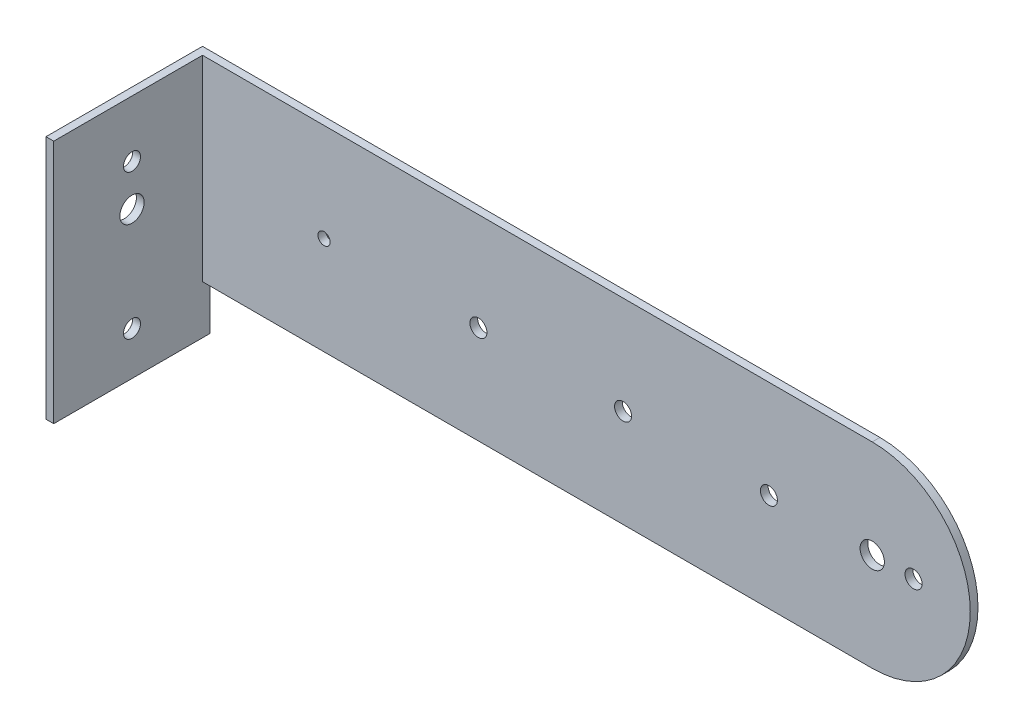
ISO-10303-21;
HEADER;
FILE_DESCRIPTION(('STEP AP214'),'2;1');
FILE_NAME('part.step','',(''),(''),'','','');
FILE_SCHEMA(('AUTOMOTIVE_DESIGN { 1 0 10303 214 1 1 1 1 }'));
ENDSEC;
DATA;
#1=APPLICATION_CONTEXT('core data for automotive mechanical design processes');
#2=APPLICATION_PROTOCOL_DEFINITION('international standard','automotive_design',2000,#1);
#3=PRODUCT_CONTEXT('',#1,'mechanical');
#4=PRODUCT('Part','Part','',(#3));
#5=PRODUCT_RELATED_PRODUCT_CATEGORY('part','',(#4));
#6=PRODUCT_DEFINITION_FORMATION('','',#4);
#7=PRODUCT_DEFINITION_CONTEXT('part definition',#1,'design');
#8=PRODUCT_DEFINITION('design','',#6,#7);
#9=PRODUCT_DEFINITION_SHAPE('','',#8);
#10=(LENGTH_UNIT() NAMED_UNIT(*) SI_UNIT(.MILLI.,.METRE.));
#11=(NAMED_UNIT(*) PLANE_ANGLE_UNIT() SI_UNIT($,.RADIAN.));
#12=(NAMED_UNIT(*) SI_UNIT($,.STERADIAN.) SOLID_ANGLE_UNIT());
#13=UNCERTAINTY_MEASURE_WITH_UNIT(LENGTH_MEASURE(1.E-05),#10,'distance_accuracy_value','');
#14=(GEOMETRIC_REPRESENTATION_CONTEXT(3) GLOBAL_UNCERTAINTY_ASSIGNED_CONTEXT((#13)) GLOBAL_UNIT_ASSIGNED_CONTEXT((#10,
#11,#12)) REPRESENTATION_CONTEXT('',''));
#15=CARTESIAN_POINT('',(0.,0.,0.));
#16=DIRECTION('',(0.,0.,1.));
#17=DIRECTION('',(1.,0.,0.));
#18=AXIS2_PLACEMENT_3D('',#15,#16,#17);
#19=CARTESIAN_POINT('',(-39.6100352366991,-20.1682003035615,1.59));
#20=DIRECTION('',(0.,1.,0.));
#21=DIRECTION('',(0.,0.,1.));
#22=AXIS2_PLACEMENT_3D('',#19,#20,#21);
#23=PLANE('',#22);
#24=DIRECTION('',(0.,0.,1.));
#25=VECTOR('',#24,1.);
#26=CARTESIAN_POINT('',(-98.1399647633009,-20.1682003035615,0.));
#27=LINE('',#26,#25);
#28=CARTESIAN_POINT('',(-98.1399647633009,-20.1682003035615,0.));
#29=VERTEX_POINT('',#28);
#30=CARTESIAN_POINT('',(-98.1399647633009,-20.1682003035615,1.59));
#31=VERTEX_POINT('',#30);
#32=EDGE_CURVE('E50',#29,#31,#27,.T.);
#33=ORIENTED_EDGE('',*,*,#32,.F.);
#34=DIRECTION('',(1.,0.,0.));
#35=VECTOR('',#34,1.);
#36=CARTESIAN_POINT('',(-39.6100352366991,-20.1682003035615,0.));
#37=LINE('',#36,#35);
#38=CARTESIAN_POINT('',(39.6100352366991,-20.1682003035615,0.));
#39=VERTEX_POINT('',#38);
#40=EDGE_CURVE('E103',#29,#39,#37,.T.);
#41=ORIENTED_EDGE('',*,*,#40,.T.);
#42=DIRECTION('',(0.,0.,-1.));
#43=VECTOR('',#42,1.);
#44=CARTESIAN_POINT('',(39.6100352366991,-20.1682003035615,1.59));
#45=LINE('',#44,#43);
#46=CARTESIAN_POINT('',(39.6100352366991,-20.1682003035615,1.59));
#47=VERTEX_POINT('',#46);
#48=EDGE_CURVE('E42',#47,#39,#45,.T.);
#49=ORIENTED_EDGE('',*,*,#48,.F.);
#50=DIRECTION('',(1.,0.,0.));
#51=VECTOR('',#50,1.);
#52=CARTESIAN_POINT('',(-99.7299647633009,-20.1682003035615,1.59));
#53=LINE('',#52,#51);
#54=EDGE_CURVE('E180',#31,#47,#53,.T.);
#55=ORIENTED_EDGE('',*,*,#54,.F.);
#56=EDGE_LOOP('',(#33,#41,#49,#55));
#57=FACE_BOUND('',#56,.T.);
#58=ADVANCED_FACE('F33',(#57),#23,.F.);
#59=CARTESIAN_POINT('',(-99.7299647633009,20.1682003035615,1.59));
#60=DIRECTION('',(1.,0.,0.));
#61=DIRECTION('',(0.,0.,-1.));
#62=AXIS2_PLACEMENT_3D('',#59,#60,#61);
#63=PLANE('',#62);
#64=DIRECTION('',(0.,-1.,0.));
#65=VECTOR('',#64,1.);
#66=CARTESIAN_POINT('',(-99.7299647633009,20.1682003035615,0.));
#67=LINE('',#66,#65);
#68=CARTESIAN_POINT('',(-99.7299647633009,20.1682003035615,0.));
#69=VERTEX_POINT('',#68);
#70=CARTESIAN_POINT('',(-99.7299647633009,-30.1682003035615,0.));
#71=VERTEX_POINT('',#70);
#72=EDGE_CURVE('E95',#69,#71,#67,.T.);
#73=ORIENTED_EDGE('',*,*,#72,.T.);
#74=DIRECTION('',(0.,0.,1.));
#75=VECTOR('',#74,1.);
#76=CARTESIAN_POINT('',(-99.7299647633009,-30.1682003035615,0.));
#77=LINE('',#76,#75);
#78=CARTESIAN_POINT('',(-99.7299647633009,-30.1682003035615,32.192));
#79=VERTEX_POINT('',#78);
#80=EDGE_CURVE('E100',#71,#79,#77,.T.);
#81=ORIENTED_EDGE('',*,*,#80,.T.);
#82=DIRECTION('',(0.,-1.,0.));
#83=VECTOR('',#82,1.);
#84=CARTESIAN_POINT('',(-99.7299647633009,20.1682003035615,32.192));
#85=LINE('',#84,#83);
#86=CARTESIAN_POINT('',(-99.7299647633009,20.1682003035615,32.192));
#87=VERTEX_POINT('',#86);
#88=EDGE_CURVE('E145',#87,#79,#85,.T.);
#89=ORIENTED_EDGE('',*,*,#88,.F.);
#90=DIRECTION('',(0.,0.,-1.));
#91=VECTOR('',#90,1.);
#92=CARTESIAN_POINT('',(-99.7299647633009,20.1682003035615,1.59));
#93=LINE('',#92,#91);
#94=EDGE_CURVE('E101',#87,#69,#93,.T.);
#95=ORIENTED_EDGE('',*,*,#94,.T.);
#96=EDGE_LOOP('',(#73,#81,#89,#95));
#97=FACE_BOUND('',#96,.T.);
#98=CARTESIAN_POINT('',(-99.7299647633009,8.5,16.096));
#99=DIRECTION('',(-1.,0.,0.));
#100=DIRECTION('',(0.,0.,1.));
#101=AXIS2_PLACEMENT_3D('',#98,#99,#100);
#102=CIRCLE('',#101,1.75);
#103=CARTESIAN_POINT('',(-99.7299647633009,8.5,17.846));
#104=VERTEX_POINT('',#103);
#105=EDGE_CURVE('E129',#104,#104,#102,.T.);
#106=ORIENTED_EDGE('',*,*,#105,.F.);
#107=EDGE_LOOP('',(#106));
#108=FACE_BOUND('',#107,.T.);
#109=CARTESIAN_POINT('',(-99.7299647633009,0.,16.096));
#110=DIRECTION('',(-1.,0.,0.));
#111=DIRECTION('',(0.,0.,1.));
#112=AXIS2_PLACEMENT_3D('',#109,#110,#111);
#113=CIRCLE('',#112,2.5);
#114=CARTESIAN_POINT('',(-99.7299647633009,0.,18.596));
#115=VERTEX_POINT('',#114);
#116=EDGE_CURVE('E135',#115,#115,#113,.T.);
#117=ORIENTED_EDGE('',*,*,#116,.F.);
#118=EDGE_LOOP('',(#117));
#119=FACE_BOUND('',#118,.T.);
#120=CARTESIAN_POINT('',(-99.7299647633009,-21.25,16.096));
#121=DIRECTION('',(-1.,0.,0.));
#122=DIRECTION('',(0.,0.,1.));
#123=AXIS2_PLACEMENT_3D('',#120,#121,#122);
#124=CIRCLE('',#123,1.75);
#125=CARTESIAN_POINT('',(-99.7299647633009,-21.25,17.846));
#126=VERTEX_POINT('',#125);
#127=EDGE_CURVE('E128',#126,#126,#124,.T.);
#128=ORIENTED_EDGE('',*,*,#127,.F.);
#129=EDGE_LOOP('',(#128));
#130=FACE_BOUND('',#129,.T.);
#131=ADVANCED_FACE('F35',(#97,#108,#119,#130),#63,.F.);
#132=CARTESIAN_POINT('',(39.6100352366991,0.,1.59));
#133=DIRECTION('',(0.,0.,-1.));
#134=DIRECTION('',(-1.,0.,0.));
#135=AXIS2_PLACEMENT_3D('',#132,#133,#134);
#136=CYLINDRICAL_SURFACE('',#135,20.1682003035615);
#137=CARTESIAN_POINT('',(39.6100352366991,0.,0.));
#138=DIRECTION('',(0.,0.,1.));
#139=DIRECTION('',(1.,0.,0.));
#140=AXIS2_PLACEMENT_3D('',#137,#138,#139);
#141=CIRCLE('',#140,20.1682003035615);
#142=CARTESIAN_POINT('',(39.6100352366991,20.1682003035615,0.));
#143=VERTEX_POINT('',#142);
#144=EDGE_CURVE('E188',#39,#143,#141,.T.);
#145=ORIENTED_EDGE('',*,*,#144,.T.);
#146=DIRECTION('',(0.,0.,-1.));
#147=VECTOR('',#146,1.);
#148=CARTESIAN_POINT('',(39.6100352366991,20.1682003035615,1.59));
#149=LINE('',#148,#147);
#150=CARTESIAN_POINT('',(39.6100352366991,20.1682003035615,1.59));
#151=VERTEX_POINT('',#150);
#152=EDGE_CURVE('E193',#151,#143,#149,.T.);
#153=ORIENTED_EDGE('',*,*,#152,.F.);
#154=CARTESIAN_POINT('',(39.6100352366991,0.,1.59));
#155=DIRECTION('',(0.,0.,1.));
#156=DIRECTION('',(1.,0.,0.));
#157=AXIS2_PLACEMENT_3D('',#154,#155,#156);
#158=CIRCLE('',#157,20.1682003035615);
#159=EDGE_CURVE('E182',#47,#151,#158,.T.);
#160=ORIENTED_EDGE('',*,*,#159,.F.);
#161=ORIENTED_EDGE('',*,*,#48,.T.);
#162=EDGE_LOOP('',(#145,#153,#160,#161));
#163=FACE_BOUND('',#162,.T.);
#164=ADVANCED_FACE('F223',(#163),#136,.T.);
#165=CARTESIAN_POINT('',(-39.6100352366991,20.1682003035615,1.59));
#166=DIRECTION('',(0.,-1.,0.));
#167=DIRECTION('',(0.,0.,-1.));
#168=AXIS2_PLACEMENT_3D('',#165,#166,#167);
#169=PLANE('',#168);
#170=DIRECTION('',(-1.,0.,0.));
#171=VECTOR('',#170,1.);
#172=CARTESIAN_POINT('',(-39.6100352366991,20.1682003035615,0.));
#173=LINE('',#172,#171);
#174=EDGE_CURVE('E183',#143,#69,#173,.T.);
#175=ORIENTED_EDGE('',*,*,#174,.T.);
#176=ORIENTED_EDGE('',*,*,#94,.F.);
#177=DIRECTION('',(-1.,0.,0.));
#178=VECTOR('',#177,1.);
#179=CARTESIAN_POINT('',(-98.1399647633009,20.1682003035615,32.192));
#180=LINE('',#179,#178);
#181=CARTESIAN_POINT('',(-98.1399647633009,20.1682003035615,32.192));
#182=VERTEX_POINT('',#181);
#183=EDGE_CURVE('E142',#182,#87,#180,.T.);
#184=ORIENTED_EDGE('',*,*,#183,.F.);
#185=DIRECTION('',(0.,0.,-1.));
#186=VECTOR('',#185,1.);
#187=CARTESIAN_POINT('',(-98.1399647633009,20.1682003035615,32.192));
#188=LINE('',#187,#186);
#189=CARTESIAN_POINT('',(-98.1399647633009,20.1682003035615,1.59));
#190=VERTEX_POINT('',#189);
#191=EDGE_CURVE('E147',#182,#190,#188,.T.);
#192=ORIENTED_EDGE('',*,*,#191,.T.);
#193=DIRECTION('',(-1.,0.,0.));
#194=VECTOR('',#193,1.);
#195=CARTESIAN_POINT('',(-39.6100352366991,20.1682003035615,1.59));
#196=LINE('',#195,#194);
#197=EDGE_CURVE('E185',#151,#190,#196,.T.);
#198=ORIENTED_EDGE('',*,*,#197,.F.);
#199=ORIENTED_EDGE('',*,*,#152,.T.);
#200=EDGE_LOOP('',(#175,#176,#184,#192,#198,#199));
#201=FACE_BOUND('',#200,.T.);
#202=ADVANCED_FACE('F227',(#201),#169,.F.);
#203=CARTESIAN_POINT('',(39.6100352366991,0.,1.59));
#204=DIRECTION('',(0.,0.,1.));
#205=DIRECTION('',(1.,0.,0.));
#206=AXIS2_PLACEMENT_3D('',#203,#204,#205);
#207=PLANE('',#206);
#208=CARTESIAN_POINT('',(-73.1399647633009,0.,1.59));
#209=DIRECTION('',(0.,0.,1.));
#210=DIRECTION('',(1.,0.,0.));
#211=AXIS2_PLACEMENT_3D('',#208,#209,#210);
#212=CIRCLE('',#211,1.25);
#213=CARTESIAN_POINT('',(-71.8899647633009,0.,1.59));
#214=VERTEX_POINT('',#213);
#215=EDGE_CURVE('E121',#214,#214,#212,.T.);
#216=ORIENTED_EDGE('',*,*,#215,.F.);
#217=EDGE_LOOP('',(#216));
#218=FACE_BOUND('',#217,.T.);
#219=DIRECTION('',(0.,1.,0.));
#220=VECTOR('',#219,1.);
#221=CARTESIAN_POINT('',(-98.1399647633009,20.1682003035615,1.59));
#222=LINE('',#221,#220);
#223=EDGE_CURVE('E58',#31,#190,#222,.T.);
#224=ORIENTED_EDGE('',*,*,#223,.F.);
#225=ORIENTED_EDGE('',*,*,#54,.T.);
#226=ORIENTED_EDGE('',*,*,#159,.T.);
#227=ORIENTED_EDGE('',*,*,#197,.T.);
#228=EDGE_LOOP('',(#224,#225,#226,#227));
#229=FACE_BOUND('',#228,.T.);
#230=CARTESIAN_POINT('',(48.1100352366991,0.,1.59));
#231=DIRECTION('',(0.,0.,1.));
#232=DIRECTION('',(1.,0.,0.));
#233=AXIS2_PLACEMENT_3D('',#230,#231,#232);
#234=CIRCLE('',#233,1.75);
#235=CARTESIAN_POINT('',(49.8600352366991,0.,1.59));
#236=VERTEX_POINT('',#235);
#237=EDGE_CURVE('E156',#236,#236,#234,.T.);
#238=ORIENTED_EDGE('',*,*,#237,.F.);
#239=EDGE_LOOP('',(#238));
#240=FACE_BOUND('',#239,.T.);
#241=CARTESIAN_POINT('',(18.3600352366991,0.,1.59));
#242=DIRECTION('',(0.,0.,1.));
#243=DIRECTION('',(1.,0.,0.));
#244=AXIS2_PLACEMENT_3D('',#241,#242,#243);
#245=CIRCLE('',#244,1.75);
#246=CARTESIAN_POINT('',(20.1100352366991,0.,1.59));
#247=VERTEX_POINT('',#246);
#248=EDGE_CURVE('E162',#247,#247,#245,.T.);
#249=ORIENTED_EDGE('',*,*,#248,.F.);
#250=EDGE_LOOP('',(#249));
#251=FACE_BOUND('',#250,.T.);
#252=CARTESIAN_POINT('',(-11.6399647633009,0.,1.59));
#253=DIRECTION('',(0.,0.,1.));
#254=DIRECTION('',(-1.,0.,0.));
#255=AXIS2_PLACEMENT_3D('',#252,#253,#254);
#256=CIRCLE('',#255,1.75);
#257=CARTESIAN_POINT('',(-9.88996476330091,0.,1.59));
#258=VERTEX_POINT('',#257);
#259=EDGE_CURVE('E168',#258,#258,#256,.T.);
#260=ORIENTED_EDGE('',*,*,#259,.F.);
#261=EDGE_LOOP('',(#260));
#262=FACE_BOUND('',#261,.T.);
#263=CARTESIAN_POINT('',(-41.3899647633009,0.,1.59));
#264=DIRECTION('',(0.,0.,1.));
#265=DIRECTION('',(-1.,0.,0.));
#266=AXIS2_PLACEMENT_3D('',#263,#264,#265);
#267=CIRCLE('',#266,1.75);
#268=CARTESIAN_POINT('',(-39.6399647633009,0.,1.59));
#269=VERTEX_POINT('',#268);
#270=EDGE_CURVE('E151',#269,#269,#267,.T.);
#271=ORIENTED_EDGE('',*,*,#270,.F.);
#272=EDGE_LOOP('',(#271));
#273=FACE_BOUND('',#272,.T.);
#274=CARTESIAN_POINT('',(39.6100352366991,0.,1.59));
#275=DIRECTION('',(0.,0.,1.));
#276=DIRECTION('',(1.,0.,0.));
#277=AXIS2_PLACEMENT_3D('',#274,#275,#276);
#278=CIRCLE('',#277,2.49999999999999);
#279=CARTESIAN_POINT('',(42.1100352366991,0.,1.59));
#280=VERTEX_POINT('',#279);
#281=EDGE_CURVE('E155',#280,#280,#278,.T.);
#282=ORIENTED_EDGE('',*,*,#281,.F.);
#283=EDGE_LOOP('',(#282));
#284=FACE_BOUND('',#283,.T.);
#285=ADVANCED_FACE('F231',(#218,#229,#240,#251,#262,#273,#284),#207,.T.);
#286=CARTESIAN_POINT('',(39.6100352366991,0.,0.));
#287=DIRECTION('',(0.,0.,1.));
#288=DIRECTION('',(1.,0.,0.));
#289=AXIS2_PLACEMENT_3D('',#286,#287,#288);
#290=PLANE('',#289);
#291=CARTESIAN_POINT('',(-73.1399647633009,0.,0.));
#292=DIRECTION('',(0.,0.,1.));
#293=DIRECTION('',(1.,0.,0.));
#294=AXIS2_PLACEMENT_3D('',#291,#292,#293);
#295=CIRCLE('',#294,1.25);
#296=CARTESIAN_POINT('',(-71.8899647633009,0.,0.));
#297=VERTEX_POINT('',#296);
#298=EDGE_CURVE('E37',#297,#297,#295,.T.);
#299=ORIENTED_EDGE('',*,*,#298,.T.);
#300=EDGE_LOOP('',(#299));
#301=FACE_BOUND('',#300,.T.);
#302=CARTESIAN_POINT('',(48.1100352366991,0.,0.));
#303=DIRECTION('',(0.,0.,1.));
#304=DIRECTION('',(1.,0.,0.));
#305=AXIS2_PLACEMENT_3D('',#302,#303,#304);
#306=CIRCLE('',#305,1.75);
#307=CARTESIAN_POINT('',(49.8600352366991,0.,0.));
#308=VERTEX_POINT('',#307);
#309=EDGE_CURVE('E152',#308,#308,#306,.T.);
#310=ORIENTED_EDGE('',*,*,#309,.T.);
#311=EDGE_LOOP('',(#310));
#312=FACE_BOUND('',#311,.T.);
#313=CARTESIAN_POINT('',(18.3600352366991,0.,0.));
#314=DIRECTION('',(0.,0.,1.));
#315=DIRECTION('',(1.,0.,0.));
#316=AXIS2_PLACEMENT_3D('',#313,#314,#315);
#317=CIRCLE('',#316,1.75);
#318=CARTESIAN_POINT('',(20.1100352366991,0.,0.));
#319=VERTEX_POINT('',#318);
#320=EDGE_CURVE('E159',#319,#319,#317,.T.);
#321=ORIENTED_EDGE('',*,*,#320,.T.);
#322=EDGE_LOOP('',(#321));
#323=FACE_BOUND('',#322,.T.);
#324=CARTESIAN_POINT('',(-11.6399647633009,0.,0.));
#325=DIRECTION('',(0.,0.,1.));
#326=DIRECTION('',(-1.,0.,0.));
#327=AXIS2_PLACEMENT_3D('',#324,#325,#326);
#328=CIRCLE('',#327,1.75);
#329=CARTESIAN_POINT('',(-9.88996476330091,0.,0.));
#330=VERTEX_POINT('',#329);
#331=EDGE_CURVE('E165',#330,#330,#328,.T.);
#332=ORIENTED_EDGE('',*,*,#331,.T.);
#333=EDGE_LOOP('',(#332));
#334=FACE_BOUND('',#333,.T.);
#335=CARTESIAN_POINT('',(-41.3899647633009,0.,0.));
#336=DIRECTION('',(0.,0.,1.));
#337=DIRECTION('',(-1.,0.,0.));
#338=AXIS2_PLACEMENT_3D('',#335,#336,#337);
#339=CIRCLE('',#338,1.75);
#340=CARTESIAN_POINT('',(-39.6399647633009,0.,0.));
#341=VERTEX_POINT('',#340);
#342=EDGE_CURVE('E171',#341,#341,#339,.T.);
#343=ORIENTED_EDGE('',*,*,#342,.T.);
#344=EDGE_LOOP('',(#343));
#345=FACE_BOUND('',#344,.T.);
#346=CARTESIAN_POINT('',(39.6100352366991,0.,0.));
#347=DIRECTION('',(0.,0.,1.));
#348=DIRECTION('',(1.,0.,0.));
#349=AXIS2_PLACEMENT_3D('',#346,#347,#348);
#350=CIRCLE('',#349,2.49999999999999);
#351=CARTESIAN_POINT('',(42.1100352366991,0.,0.));
#352=VERTEX_POINT('',#351);
#353=EDGE_CURVE('E104',#352,#352,#350,.T.);
#354=ORIENTED_EDGE('',*,*,#353,.T.);
#355=EDGE_LOOP('',(#354));
#356=FACE_BOUND('',#355,.T.);
#357=ORIENTED_EDGE('',*,*,#72,.F.);
#358=ORIENTED_EDGE('',*,*,#174,.F.);
#359=ORIENTED_EDGE('',*,*,#144,.F.);
#360=ORIENTED_EDGE('',*,*,#40,.F.);
#361=DIRECTION('',(0.,1.,0.));
#362=VECTOR('',#361,1.);
#363=CARTESIAN_POINT('',(-98.1399647633009,-20.1682003035615,0.));
#364=LINE('',#363,#362);
#365=CARTESIAN_POINT('',(-98.1399647633009,-30.1682003035615,0.));
#366=VERTEX_POINT('',#365);
#367=EDGE_CURVE('E111',#366,#29,#364,.T.);
#368=ORIENTED_EDGE('',*,*,#367,.F.);
#369=DIRECTION('',(-1.,0.,0.));
#370=VECTOR('',#369,1.);
#371=CARTESIAN_POINT('',(-64.4305467321334,-30.1682003035615,0.));
#372=LINE('',#371,#370);
#373=EDGE_CURVE('E108',#366,#71,#372,.T.);
#374=ORIENTED_EDGE('',*,*,#373,.T.);
#375=EDGE_LOOP('',(#357,#358,#359,#360,#368,#374));
#376=FACE_BOUND('',#375,.T.);
#377=ADVANCED_FACE('F109',(#301,#312,#323,#334,#345,#356,#376),#290,.F.);
#378=CARTESIAN_POINT('',(39.6100352366991,0.,0.));
#379=DIRECTION('',(0.,0.,1.));
#380=DIRECTION('',(1.,0.,0.));
#381=AXIS2_PLACEMENT_3D('',#378,#379,#380);
#382=CYLINDRICAL_SURFACE('',#381,2.49999999999999);
#383=CARTESIAN_POINT('',(42.1100352366991,0.,0.));
#384=CARTESIAN_POINT('',(42.1100352366991,0.,0.0165625));
#385=CARTESIAN_POINT('',(42.1100352366991,0.,0.033125));
#386=CARTESIAN_POINT('',(42.1100352366991,0.,0.06625));
#387=CARTESIAN_POINT('',(42.1100352366991,0.,0.0828125));
#388=CARTESIAN_POINT('',(42.1100352366991,0.,0.1159375));
#389=CARTESIAN_POINT('',(42.1100352366991,0.,0.1325));
#390=CARTESIAN_POINT('',(42.1100352366991,0.,0.165625));
#391=CARTESIAN_POINT('',(42.1100352366991,0.,0.1821875));
#392=CARTESIAN_POINT('',(42.1100352366991,0.,0.2153125));
#393=CARTESIAN_POINT('',(42.1100352366991,0.,0.231875));
#394=CARTESIAN_POINT('',(42.1100352366991,0.,0.265));
#395=CARTESIAN_POINT('',(42.1100352366991,0.,0.2815625));
#396=CARTESIAN_POINT('',(42.1100352366991,0.,0.3146875));
#397=CARTESIAN_POINT('',(42.1100352366991,0.,0.33125));
#398=CARTESIAN_POINT('',(42.1100352366991,0.,0.364375));
#399=CARTESIAN_POINT('',(42.1100352366991,0.,0.3809375));
#400=CARTESIAN_POINT('',(42.1100352366991,0.,0.4140625));
#401=CARTESIAN_POINT('',(42.1100352366991,0.,0.430625));
#402=CARTESIAN_POINT('',(42.1100352366991,0.,0.46375));
#403=CARTESIAN_POINT('',(42.1100352366991,0.,0.4803125));
#404=CARTESIAN_POINT('',(42.1100352366991,0.,0.5134375));
#405=CARTESIAN_POINT('',(42.1100352366991,0.,0.53));
#406=CARTESIAN_POINT('',(42.1100352366991,0.,0.563125));
#407=CARTESIAN_POINT('',(42.1100352366991,0.,0.5796875));
#408=CARTESIAN_POINT('',(42.1100352366991,0.,0.6128125));
#409=CARTESIAN_POINT('',(42.1100352366991,0.,0.629375));
#410=CARTESIAN_POINT('',(42.1100352366991,0.,0.6625));
#411=CARTESIAN_POINT('',(42.1100352366991,0.,0.6790625));
#412=CARTESIAN_POINT('',(42.1100352366991,0.,0.7121875));
#413=CARTESIAN_POINT('',(42.1100352366991,0.,0.72875));
#414=CARTESIAN_POINT('',(42.1100352366991,0.,0.761875));
#415=CARTESIAN_POINT('',(42.1100352366991,0.,0.7784375));
#416=CARTESIAN_POINT('',(42.1100352366991,0.,0.8115625));
#417=CARTESIAN_POINT('',(42.1100352366991,0.,0.828125));
#418=CARTESIAN_POINT('',(42.1100352366991,0.,0.86125));
#419=CARTESIAN_POINT('',(42.1100352366991,0.,0.8778125));
#420=CARTESIAN_POINT('',(42.1100352366991,0.,0.9109375));
#421=CARTESIAN_POINT('',(42.1100352366991,0.,0.9275));
#422=CARTESIAN_POINT('',(42.1100352366991,0.,0.960625));
#423=CARTESIAN_POINT('',(42.1100352366991,0.,0.9771875));
#424=CARTESIAN_POINT('',(42.1100352366991,0.,1.0103125));
#425=CARTESIAN_POINT('',(42.1100352366991,0.,1.026875));
#426=CARTESIAN_POINT('',(42.1100352366991,0.,1.06));
#427=CARTESIAN_POINT('',(42.1100352366991,0.,1.0765625));
#428=CARTESIAN_POINT('',(42.1100352366991,0.,1.1096875));
#429=CARTESIAN_POINT('',(42.1100352366991,0.,1.12625));
#430=CARTESIAN_POINT('',(42.1100352366991,0.,1.159375));
#431=CARTESIAN_POINT('',(42.1100352366991,0.,1.1759375));
#432=CARTESIAN_POINT('',(42.1100352366991,0.,1.2090625));
#433=CARTESIAN_POINT('',(42.1100352366991,0.,1.225625));
#434=CARTESIAN_POINT('',(42.1100352366991,0.,1.25875));
#435=CARTESIAN_POINT('',(42.1100352366991,0.,1.2753125));
#436=CARTESIAN_POINT('',(42.1100352366991,0.,1.3084375));
#437=CARTESIAN_POINT('',(42.1100352366991,0.,1.325));
#438=CARTESIAN_POINT('',(42.1100352366991,0.,1.358125));
#439=CARTESIAN_POINT('',(42.1100352366991,0.,1.3746875));
#440=CARTESIAN_POINT('',(42.1100352366991,0.,1.4078125));
#441=CARTESIAN_POINT('',(42.1100352366991,0.,1.424375));
#442=CARTESIAN_POINT('',(42.1100352366991,0.,1.4575));
#443=CARTESIAN_POINT('',(42.1100352366991,0.,1.4740625));
#444=CARTESIAN_POINT('',(42.1100352366991,0.,1.5071875));
#445=CARTESIAN_POINT('',(42.1100352366991,0.,1.52375));
#446=CARTESIAN_POINT('',(42.1100352366991,0.,1.556875));
#447=CARTESIAN_POINT('',(42.1100352366991,0.,1.5734375));
#448=CARTESIAN_POINT('',(42.1100352366991,0.,1.59));
#449=B_SPLINE_CURVE_WITH_KNOTS('',3,(#383,#384,#385,#386,#387,#388,#389,#390,#391,#392,#393,
#394,#395,#396,#397,#398,#399,#400,#401,#402,#403,#404,#405,#406,#407,#408,#409,#410,#411,#412,
#413,#414,#415,#416,#417,#418,#419,#420,#421,#422,#423,#424,#425,#426,#427,#428,#429,#430,#431,
#432,#433,#434,#435,#436,#437,#438,#439,#440,#441,#442,#443,#444,#445,#446,#447,#448),
.UNSPECIFIED.,.F.,.F.,(4,2,2,2,2,2,2,2,2,2,2,2,2,2,2,2,2,2,2,2,2,2,2,2,2,2,2,2,2,2,2,2,4),(0.,
0.0496875,0.099375,0.1490625,0.19875,0.2484375,0.298125,0.3478125,0.3975,0.4471875,0.496875,
0.5465625,0.59625,0.6459375,0.695625,0.7453125,0.795,0.8446875,0.894375,0.9440625,0.99375,
1.0434375,1.093125,1.1428125,1.1925,1.2421875,1.291875,1.3415625,1.39125,1.4409375,1.490625,
1.5403125,1.59),.UNSPECIFIED.);
#450=EDGE_CURVE('BSEAM235',#352,#280,#449,.T.);
#451=ORIENTED_EDGE('',*,*,#353,.F.);
#452=ORIENTED_EDGE('',*,*,#281,.T.);
#453=ORIENTED_EDGE('',*,*,#450,.T.);
#454=ORIENTED_EDGE('',*,*,#450,.F.);
#455=EDGE_LOOP('',(#451,#453,#452,#454));
#456=FACE_BOUND('',#455,.T.);
#457=ADVANCED_FACE('F235',(#456),#382,.F.);
#458=CARTESIAN_POINT('',(-41.3899647633009,0.,0.));
#459=DIRECTION('',(0.,0.,1.));
#460=DIRECTION('',(1.,0.,0.));
#461=AXIS2_PLACEMENT_3D('',#458,#459,#460);
#462=CYLINDRICAL_SURFACE('',#461,1.75);
#463=CARTESIAN_POINT('',(-39.6399647633009,0.,0.));
#464=CARTESIAN_POINT('',(-39.6399647633009,0.,0.0165625));
#465=CARTESIAN_POINT('',(-39.6399647633009,0.,0.033125));
#466=CARTESIAN_POINT('',(-39.6399647633009,0.,0.06625));
#467=CARTESIAN_POINT('',(-39.6399647633009,0.,0.0828125));
#468=CARTESIAN_POINT('',(-39.6399647633009,0.,0.1159375));
#469=CARTESIAN_POINT('',(-39.6399647633009,0.,0.1325));
#470=CARTESIAN_POINT('',(-39.6399647633009,0.,0.165625));
#471=CARTESIAN_POINT('',(-39.6399647633009,0.,0.1821875));
#472=CARTESIAN_POINT('',(-39.6399647633009,0.,0.2153125));
#473=CARTESIAN_POINT('',(-39.6399647633009,0.,0.231875));
#474=CARTESIAN_POINT('',(-39.6399647633009,0.,0.265));
#475=CARTESIAN_POINT('',(-39.6399647633009,0.,0.2815625));
#476=CARTESIAN_POINT('',(-39.6399647633009,0.,0.3146875));
#477=CARTESIAN_POINT('',(-39.6399647633009,0.,0.33125));
#478=CARTESIAN_POINT('',(-39.6399647633009,0.,0.364375));
#479=CARTESIAN_POINT('',(-39.6399647633009,0.,0.3809375));
#480=CARTESIAN_POINT('',(-39.6399647633009,0.,0.4140625));
#481=CARTESIAN_POINT('',(-39.6399647633009,0.,0.430625));
#482=CARTESIAN_POINT('',(-39.6399647633009,0.,0.46375));
#483=CARTESIAN_POINT('',(-39.6399647633009,0.,0.4803125));
#484=CARTESIAN_POINT('',(-39.6399647633009,0.,0.5134375));
#485=CARTESIAN_POINT('',(-39.6399647633009,0.,0.53));
#486=CARTESIAN_POINT('',(-39.6399647633009,0.,0.563125));
#487=CARTESIAN_POINT('',(-39.6399647633009,0.,0.5796875));
#488=CARTESIAN_POINT('',(-39.6399647633009,0.,0.6128125));
#489=CARTESIAN_POINT('',(-39.6399647633009,0.,0.629375));
#490=CARTESIAN_POINT('',(-39.6399647633009,0.,0.6625));
#491=CARTESIAN_POINT('',(-39.6399647633009,0.,0.6790625));
#492=CARTESIAN_POINT('',(-39.6399647633009,0.,0.7121875));
#493=CARTESIAN_POINT('',(-39.6399647633009,0.,0.72875));
#494=CARTESIAN_POINT('',(-39.6399647633009,0.,0.761875));
#495=CARTESIAN_POINT('',(-39.6399647633009,0.,0.7784375));
#496=CARTESIAN_POINT('',(-39.6399647633009,0.,0.8115625));
#497=CARTESIAN_POINT('',(-39.6399647633009,0.,0.828125));
#498=CARTESIAN_POINT('',(-39.6399647633009,0.,0.86125));
#499=CARTESIAN_POINT('',(-39.6399647633009,0.,0.8778125));
#500=CARTESIAN_POINT('',(-39.6399647633009,0.,0.9109375));
#501=CARTESIAN_POINT('',(-39.6399647633009,0.,0.9275));
#502=CARTESIAN_POINT('',(-39.6399647633009,0.,0.960625));
#503=CARTESIAN_POINT('',(-39.6399647633009,0.,0.9771875));
#504=CARTESIAN_POINT('',(-39.6399647633009,0.,1.0103125));
#505=CARTESIAN_POINT('',(-39.6399647633009,0.,1.026875));
#506=CARTESIAN_POINT('',(-39.6399647633009,0.,1.06));
#507=CARTESIAN_POINT('',(-39.6399647633009,0.,1.0765625));
#508=CARTESIAN_POINT('',(-39.6399647633009,0.,1.1096875));
#509=CARTESIAN_POINT('',(-39.6399647633009,0.,1.12625));
#510=CARTESIAN_POINT('',(-39.6399647633009,0.,1.159375));
#511=CARTESIAN_POINT('',(-39.6399647633009,0.,1.1759375));
#512=CARTESIAN_POINT('',(-39.6399647633009,0.,1.2090625));
#513=CARTESIAN_POINT('',(-39.6399647633009,0.,1.225625));
#514=CARTESIAN_POINT('',(-39.6399647633009,0.,1.25875));
#515=CARTESIAN_POINT('',(-39.6399647633009,0.,1.2753125));
#516=CARTESIAN_POINT('',(-39.6399647633009,0.,1.3084375));
#517=CARTESIAN_POINT('',(-39.6399647633009,0.,1.325));
#518=CARTESIAN_POINT('',(-39.6399647633009,0.,1.358125));
#519=CARTESIAN_POINT('',(-39.6399647633009,0.,1.3746875));
#520=CARTESIAN_POINT('',(-39.6399647633009,0.,1.4078125));
#521=CARTESIAN_POINT('',(-39.6399647633009,0.,1.424375));
#522=CARTESIAN_POINT('',(-39.6399647633009,0.,1.4575));
#523=CARTESIAN_POINT('',(-39.6399647633009,0.,1.4740625));
#524=CARTESIAN_POINT('',(-39.6399647633009,0.,1.5071875));
#525=CARTESIAN_POINT('',(-39.6399647633009,0.,1.52375));
#526=CARTESIAN_POINT('',(-39.6399647633009,0.,1.556875));
#527=CARTESIAN_POINT('',(-39.6399647633009,0.,1.5734375));
#528=CARTESIAN_POINT('',(-39.6399647633009,0.,1.59));
#529=B_SPLINE_CURVE_WITH_KNOTS('',3,(#463,#464,#465,#466,#467,#468,#469,#470,#471,#472,#473,
#474,#475,#476,#477,#478,#479,#480,#481,#482,#483,#484,#485,#486,#487,#488,#489,#490,#491,#492,
#493,#494,#495,#496,#497,#498,#499,#500,#501,#502,#503,#504,#505,#506,#507,#508,#509,#510,#511,
#512,#513,#514,#515,#516,#517,#518,#519,#520,#521,#522,#523,#524,#525,#526,#527,#528),
.UNSPECIFIED.,.F.,.F.,(4,2,2,2,2,2,2,2,2,2,2,2,2,2,2,2,2,2,2,2,2,2,2,2,2,2,2,2,2,2,2,2,4),(0.,
0.0496875,0.099375,0.1490625,0.19875,0.2484375,0.298125,0.3478125,0.3975,0.4471875,0.496875,
0.5465625,0.59625,0.6459375,0.695625,0.7453125,0.795,0.8446875,0.894375,0.9440625,0.99375,
1.0434375,1.093125,1.1428125,1.1925,1.2421875,1.291875,1.3415625,1.39125,1.4409375,1.490625,
1.5403125,1.59),.UNSPECIFIED.);
#530=EDGE_CURVE('BSEAM242',#341,#269,#529,.T.);
#531=ORIENTED_EDGE('',*,*,#342,.F.);
#532=ORIENTED_EDGE('',*,*,#270,.T.);
#533=ORIENTED_EDGE('',*,*,#530,.T.);
#534=ORIENTED_EDGE('',*,*,#530,.F.);
#535=EDGE_LOOP('',(#531,#533,#532,#534));
#536=FACE_BOUND('',#535,.T.);
#537=ADVANCED_FACE('F242',(#536),#462,.F.);
#538=CARTESIAN_POINT('',(-11.6399647633009,0.,0.));
#539=DIRECTION('',(0.,0.,1.));
#540=DIRECTION('',(1.,0.,0.));
#541=AXIS2_PLACEMENT_3D('',#538,#539,#540);
#542=CYLINDRICAL_SURFACE('',#541,1.75);
#543=CARTESIAN_POINT('',(-9.88996476330091,0.,0.));
#544=CARTESIAN_POINT('',(-9.88996476330091,0.,0.0165625));
#545=CARTESIAN_POINT('',(-9.88996476330091,0.,0.033125));
#546=CARTESIAN_POINT('',(-9.88996476330091,0.,0.06625));
#547=CARTESIAN_POINT('',(-9.88996476330091,0.,0.0828125));
#548=CARTESIAN_POINT('',(-9.88996476330091,0.,0.1159375));
#549=CARTESIAN_POINT('',(-9.88996476330091,0.,0.1325));
#550=CARTESIAN_POINT('',(-9.88996476330091,0.,0.165625));
#551=CARTESIAN_POINT('',(-9.88996476330091,0.,0.1821875));
#552=CARTESIAN_POINT('',(-9.88996476330091,0.,0.2153125));
#553=CARTESIAN_POINT('',(-9.88996476330091,0.,0.231875));
#554=CARTESIAN_POINT('',(-9.88996476330091,0.,0.265));
#555=CARTESIAN_POINT('',(-9.88996476330091,0.,0.2815625));
#556=CARTESIAN_POINT('',(-9.88996476330091,0.,0.3146875));
#557=CARTESIAN_POINT('',(-9.88996476330091,0.,0.33125));
#558=CARTESIAN_POINT('',(-9.88996476330091,0.,0.364375));
#559=CARTESIAN_POINT('',(-9.88996476330091,0.,0.3809375));
#560=CARTESIAN_POINT('',(-9.88996476330091,0.,0.4140625));
#561=CARTESIAN_POINT('',(-9.88996476330091,0.,0.430625));
#562=CARTESIAN_POINT('',(-9.88996476330091,0.,0.46375));
#563=CARTESIAN_POINT('',(-9.88996476330091,0.,0.4803125));
#564=CARTESIAN_POINT('',(-9.88996476330091,0.,0.5134375));
#565=CARTESIAN_POINT('',(-9.88996476330091,0.,0.53));
#566=CARTESIAN_POINT('',(-9.88996476330091,0.,0.563125));
#567=CARTESIAN_POINT('',(-9.88996476330091,0.,0.5796875));
#568=CARTESIAN_POINT('',(-9.88996476330091,0.,0.6128125));
#569=CARTESIAN_POINT('',(-9.88996476330091,0.,0.629375));
#570=CARTESIAN_POINT('',(-9.88996476330091,0.,0.6625));
#571=CARTESIAN_POINT('',(-9.88996476330091,0.,0.6790625));
#572=CARTESIAN_POINT('',(-9.88996476330091,0.,0.7121875));
#573=CARTESIAN_POINT('',(-9.88996476330091,0.,0.72875));
#574=CARTESIAN_POINT('',(-9.88996476330091,0.,0.761875));
#575=CARTESIAN_POINT('',(-9.88996476330091,0.,0.7784375));
#576=CARTESIAN_POINT('',(-9.88996476330091,0.,0.8115625));
#577=CARTESIAN_POINT('',(-9.88996476330091,0.,0.828125));
#578=CARTESIAN_POINT('',(-9.88996476330091,0.,0.86125));
#579=CARTESIAN_POINT('',(-9.88996476330091,0.,0.8778125));
#580=CARTESIAN_POINT('',(-9.88996476330091,0.,0.9109375));
#581=CARTESIAN_POINT('',(-9.88996476330091,0.,0.9275));
#582=CARTESIAN_POINT('',(-9.88996476330091,0.,0.960625));
#583=CARTESIAN_POINT('',(-9.88996476330091,0.,0.9771875));
#584=CARTESIAN_POINT('',(-9.88996476330091,0.,1.0103125));
#585=CARTESIAN_POINT('',(-9.88996476330091,0.,1.026875));
#586=CARTESIAN_POINT('',(-9.88996476330091,0.,1.06));
#587=CARTESIAN_POINT('',(-9.88996476330091,0.,1.0765625));
#588=CARTESIAN_POINT('',(-9.88996476330091,0.,1.1096875));
#589=CARTESIAN_POINT('',(-9.88996476330091,0.,1.12625));
#590=CARTESIAN_POINT('',(-9.88996476330091,0.,1.159375));
#591=CARTESIAN_POINT('',(-9.88996476330091,0.,1.1759375));
#592=CARTESIAN_POINT('',(-9.88996476330091,0.,1.2090625));
#593=CARTESIAN_POINT('',(-9.88996476330091,0.,1.225625));
#594=CARTESIAN_POINT('',(-9.88996476330091,0.,1.25875));
#595=CARTESIAN_POINT('',(-9.88996476330091,0.,1.2753125));
#596=CARTESIAN_POINT('',(-9.88996476330091,0.,1.3084375));
#597=CARTESIAN_POINT('',(-9.88996476330091,0.,1.325));
#598=CARTESIAN_POINT('',(-9.88996476330091,0.,1.358125));
#599=CARTESIAN_POINT('',(-9.88996476330091,0.,1.3746875));
#600=CARTESIAN_POINT('',(-9.88996476330091,0.,1.4078125));
#601=CARTESIAN_POINT('',(-9.88996476330091,0.,1.424375));
#602=CARTESIAN_POINT('',(-9.88996476330091,0.,1.4575));
#603=CARTESIAN_POINT('',(-9.88996476330091,0.,1.4740625));
#604=CARTESIAN_POINT('',(-9.88996476330091,0.,1.5071875));
#605=CARTESIAN_POINT('',(-9.88996476330091,0.,1.52375));
#606=CARTESIAN_POINT('',(-9.88996476330091,0.,1.556875));
#607=CARTESIAN_POINT('',(-9.88996476330091,0.,1.5734375));
#608=CARTESIAN_POINT('',(-9.88996476330091,0.,1.59));
#609=B_SPLINE_CURVE_WITH_KNOTS('',3,(#543,#544,#545,#546,#547,#548,#549,#550,#551,#552,#553,
#554,#555,#556,#557,#558,#559,#560,#561,#562,#563,#564,#565,#566,#567,#568,#569,#570,#571,#572,
#573,#574,#575,#576,#577,#578,#579,#580,#581,#582,#583,#584,#585,#586,#587,#588,#589,#590,#591,
#592,#593,#594,#595,#596,#597,#598,#599,#600,#601,#602,#603,#604,#605,#606,#607,#608),
.UNSPECIFIED.,.F.,.F.,(4,2,2,2,2,2,2,2,2,2,2,2,2,2,2,2,2,2,2,2,2,2,2,2,2,2,2,2,2,2,2,2,4),(0.,
0.0496875,0.099375,0.1490625,0.19875,0.2484375,0.298125,0.3478125,0.3975,0.4471875,0.496875,
0.5465625,0.59625,0.6459375,0.695625,0.7453125,0.795,0.8446875,0.894375,0.9440625,0.99375,
1.0434375,1.093125,1.1428125,1.1925,1.2421875,1.291875,1.3415625,1.39125,1.4409375,1.490625,
1.5403125,1.59),.UNSPECIFIED.);
#610=EDGE_CURVE('BSEAM246',#330,#258,#609,.T.);
#611=ORIENTED_EDGE('',*,*,#331,.F.);
#612=ORIENTED_EDGE('',*,*,#259,.T.);
#613=ORIENTED_EDGE('',*,*,#610,.T.);
#614=ORIENTED_EDGE('',*,*,#610,.F.);
#615=EDGE_LOOP('',(#611,#613,#612,#614));
#616=FACE_BOUND('',#615,.T.);
#617=ADVANCED_FACE('F246',(#616),#542,.F.);
#618=CARTESIAN_POINT('',(18.3600352366991,0.,0.));
#619=DIRECTION('',(0.,0.,1.));
#620=DIRECTION('',(1.,0.,0.));
#621=AXIS2_PLACEMENT_3D('',#618,#619,#620);
#622=CYLINDRICAL_SURFACE('',#621,1.75);
#623=CARTESIAN_POINT('',(20.1100352366991,0.,0.));
#624=CARTESIAN_POINT('',(20.1100352366991,0.,0.0165625));
#625=CARTESIAN_POINT('',(20.1100352366991,0.,0.033125));
#626=CARTESIAN_POINT('',(20.1100352366991,0.,0.06625));
#627=CARTESIAN_POINT('',(20.1100352366991,0.,0.0828125));
#628=CARTESIAN_POINT('',(20.1100352366991,0.,0.1159375));
#629=CARTESIAN_POINT('',(20.1100352366991,0.,0.1325));
#630=CARTESIAN_POINT('',(20.1100352366991,0.,0.165625));
#631=CARTESIAN_POINT('',(20.1100352366991,0.,0.1821875));
#632=CARTESIAN_POINT('',(20.1100352366991,0.,0.2153125));
#633=CARTESIAN_POINT('',(20.1100352366991,0.,0.231875));
#634=CARTESIAN_POINT('',(20.1100352366991,0.,0.265));
#635=CARTESIAN_POINT('',(20.1100352366991,0.,0.2815625));
#636=CARTESIAN_POINT('',(20.1100352366991,0.,0.3146875));
#637=CARTESIAN_POINT('',(20.1100352366991,0.,0.33125));
#638=CARTESIAN_POINT('',(20.1100352366991,0.,0.364375));
#639=CARTESIAN_POINT('',(20.1100352366991,0.,0.3809375));
#640=CARTESIAN_POINT('',(20.1100352366991,0.,0.4140625));
#641=CARTESIAN_POINT('',(20.1100352366991,0.,0.430625));
#642=CARTESIAN_POINT('',(20.1100352366991,0.,0.46375));
#643=CARTESIAN_POINT('',(20.1100352366991,0.,0.4803125));
#644=CARTESIAN_POINT('',(20.1100352366991,0.,0.5134375));
#645=CARTESIAN_POINT('',(20.1100352366991,0.,0.53));
#646=CARTESIAN_POINT('',(20.1100352366991,0.,0.563125));
#647=CARTESIAN_POINT('',(20.1100352366991,0.,0.5796875));
#648=CARTESIAN_POINT('',(20.1100352366991,0.,0.6128125));
#649=CARTESIAN_POINT('',(20.1100352366991,0.,0.629375));
#650=CARTESIAN_POINT('',(20.1100352366991,0.,0.6625));
#651=CARTESIAN_POINT('',(20.1100352366991,0.,0.6790625));
#652=CARTESIAN_POINT('',(20.1100352366991,0.,0.7121875));
#653=CARTESIAN_POINT('',(20.1100352366991,0.,0.72875));
#654=CARTESIAN_POINT('',(20.1100352366991,0.,0.761875));
#655=CARTESIAN_POINT('',(20.1100352366991,0.,0.7784375));
#656=CARTESIAN_POINT('',(20.1100352366991,0.,0.8115625));
#657=CARTESIAN_POINT('',(20.1100352366991,0.,0.828125));
#658=CARTESIAN_POINT('',(20.1100352366991,0.,0.86125));
#659=CARTESIAN_POINT('',(20.1100352366991,0.,0.8778125));
#660=CARTESIAN_POINT('',(20.1100352366991,0.,0.9109375));
#661=CARTESIAN_POINT('',(20.1100352366991,0.,0.9275));
#662=CARTESIAN_POINT('',(20.1100352366991,0.,0.960625));
#663=CARTESIAN_POINT('',(20.1100352366991,0.,0.9771875));
#664=CARTESIAN_POINT('',(20.1100352366991,0.,1.0103125));
#665=CARTESIAN_POINT('',(20.1100352366991,0.,1.026875));
#666=CARTESIAN_POINT('',(20.1100352366991,0.,1.06));
#667=CARTESIAN_POINT('',(20.1100352366991,0.,1.0765625));
#668=CARTESIAN_POINT('',(20.1100352366991,0.,1.1096875));
#669=CARTESIAN_POINT('',(20.1100352366991,0.,1.12625));
#670=CARTESIAN_POINT('',(20.1100352366991,0.,1.159375));
#671=CARTESIAN_POINT('',(20.1100352366991,0.,1.1759375));
#672=CARTESIAN_POINT('',(20.1100352366991,0.,1.2090625));
#673=CARTESIAN_POINT('',(20.1100352366991,0.,1.225625));
#674=CARTESIAN_POINT('',(20.1100352366991,0.,1.25875));
#675=CARTESIAN_POINT('',(20.1100352366991,0.,1.2753125));
#676=CARTESIAN_POINT('',(20.1100352366991,0.,1.3084375));
#677=CARTESIAN_POINT('',(20.1100352366991,0.,1.325));
#678=CARTESIAN_POINT('',(20.1100352366991,0.,1.358125));
#679=CARTESIAN_POINT('',(20.1100352366991,0.,1.3746875));
#680=CARTESIAN_POINT('',(20.1100352366991,0.,1.4078125));
#681=CARTESIAN_POINT('',(20.1100352366991,0.,1.424375));
#682=CARTESIAN_POINT('',(20.1100352366991,0.,1.4575));
#683=CARTESIAN_POINT('',(20.1100352366991,0.,1.4740625));
#684=CARTESIAN_POINT('',(20.1100352366991,0.,1.5071875));
#685=CARTESIAN_POINT('',(20.1100352366991,0.,1.52375));
#686=CARTESIAN_POINT('',(20.1100352366991,0.,1.556875));
#687=CARTESIAN_POINT('',(20.1100352366991,0.,1.5734375));
#688=CARTESIAN_POINT('',(20.1100352366991,0.,1.59));
#689=B_SPLINE_CURVE_WITH_KNOTS('',3,(#623,#624,#625,#626,#627,#628,#629,#630,#631,#632,#633,
#634,#635,#636,#637,#638,#639,#640,#641,#642,#643,#644,#645,#646,#647,#648,#649,#650,#651,#652,
#653,#654,#655,#656,#657,#658,#659,#660,#661,#662,#663,#664,#665,#666,#667,#668,#669,#670,#671,
#672,#673,#674,#675,#676,#677,#678,#679,#680,#681,#682,#683,#684,#685,#686,#687,#688),
.UNSPECIFIED.,.F.,.F.,(4,2,2,2,2,2,2,2,2,2,2,2,2,2,2,2,2,2,2,2,2,2,2,2,2,2,2,2,2,2,2,2,4),(0.,
0.0496875,0.099375,0.1490625,0.19875,0.2484375,0.298125,0.3478125,0.3975,0.4471875,0.496875,
0.5465625,0.59625,0.6459375,0.695625,0.7453125,0.795,0.8446875,0.894375,0.9440625,0.99375,
1.0434375,1.093125,1.1428125,1.1925,1.2421875,1.291875,1.3415625,1.39125,1.4409375,1.490625,
1.5403125,1.59),.UNSPECIFIED.);
#690=EDGE_CURVE('BSEAM250',#319,#247,#689,.T.);
#691=ORIENTED_EDGE('',*,*,#320,.F.);
#692=ORIENTED_EDGE('',*,*,#248,.T.);
#693=ORIENTED_EDGE('',*,*,#690,.T.);
#694=ORIENTED_EDGE('',*,*,#690,.F.);
#695=EDGE_LOOP('',(#691,#693,#692,#694));
#696=FACE_BOUND('',#695,.T.);
#697=ADVANCED_FACE('F250',(#696),#622,.F.);
#698=CARTESIAN_POINT('',(48.1100352366991,0.,0.));
#699=DIRECTION('',(0.,0.,1.));
#700=DIRECTION('',(1.,0.,0.));
#701=AXIS2_PLACEMENT_3D('',#698,#699,#700);
#702=CYLINDRICAL_SURFACE('',#701,1.75);
#703=CARTESIAN_POINT('',(49.8600352366991,0.,0.));
#704=CARTESIAN_POINT('',(49.8600352366991,0.,0.0165625));
#705=CARTESIAN_POINT('',(49.8600352366991,0.,0.033125));
#706=CARTESIAN_POINT('',(49.8600352366991,0.,0.06625));
#707=CARTESIAN_POINT('',(49.8600352366991,0.,0.0828125));
#708=CARTESIAN_POINT('',(49.8600352366991,0.,0.1159375));
#709=CARTESIAN_POINT('',(49.8600352366991,0.,0.1325));
#710=CARTESIAN_POINT('',(49.8600352366991,0.,0.165625));
#711=CARTESIAN_POINT('',(49.8600352366991,0.,0.1821875));
#712=CARTESIAN_POINT('',(49.8600352366991,0.,0.2153125));
#713=CARTESIAN_POINT('',(49.8600352366991,0.,0.231875));
#714=CARTESIAN_POINT('',(49.8600352366991,0.,0.265));
#715=CARTESIAN_POINT('',(49.8600352366991,0.,0.2815625));
#716=CARTESIAN_POINT('',(49.8600352366991,0.,0.3146875));
#717=CARTESIAN_POINT('',(49.8600352366991,0.,0.33125));
#718=CARTESIAN_POINT('',(49.8600352366991,0.,0.364375));
#719=CARTESIAN_POINT('',(49.8600352366991,0.,0.3809375));
#720=CARTESIAN_POINT('',(49.8600352366991,0.,0.4140625));
#721=CARTESIAN_POINT('',(49.8600352366991,0.,0.430625));
#722=CARTESIAN_POINT('',(49.8600352366991,0.,0.46375));
#723=CARTESIAN_POINT('',(49.8600352366991,0.,0.4803125));
#724=CARTESIAN_POINT('',(49.8600352366991,0.,0.5134375));
#725=CARTESIAN_POINT('',(49.8600352366991,0.,0.53));
#726=CARTESIAN_POINT('',(49.8600352366991,0.,0.563125));
#727=CARTESIAN_POINT('',(49.8600352366991,0.,0.5796875));
#728=CARTESIAN_POINT('',(49.8600352366991,0.,0.6128125));
#729=CARTESIAN_POINT('',(49.8600352366991,0.,0.629375));
#730=CARTESIAN_POINT('',(49.8600352366991,0.,0.6625));
#731=CARTESIAN_POINT('',(49.8600352366991,0.,0.6790625));
#732=CARTESIAN_POINT('',(49.8600352366991,0.,0.7121875));
#733=CARTESIAN_POINT('',(49.8600352366991,0.,0.72875));
#734=CARTESIAN_POINT('',(49.8600352366991,0.,0.761875));
#735=CARTESIAN_POINT('',(49.8600352366991,0.,0.7784375));
#736=CARTESIAN_POINT('',(49.8600352366991,0.,0.8115625));
#737=CARTESIAN_POINT('',(49.8600352366991,0.,0.828125));
#738=CARTESIAN_POINT('',(49.8600352366991,0.,0.86125));
#739=CARTESIAN_POINT('',(49.8600352366991,0.,0.8778125));
#740=CARTESIAN_POINT('',(49.8600352366991,0.,0.9109375));
#741=CARTESIAN_POINT('',(49.8600352366991,0.,0.9275));
#742=CARTESIAN_POINT('',(49.8600352366991,0.,0.960625));
#743=CARTESIAN_POINT('',(49.8600352366991,0.,0.9771875));
#744=CARTESIAN_POINT('',(49.8600352366991,0.,1.0103125));
#745=CARTESIAN_POINT('',(49.8600352366991,0.,1.026875));
#746=CARTESIAN_POINT('',(49.8600352366991,0.,1.06));
#747=CARTESIAN_POINT('',(49.8600352366991,0.,1.0765625));
#748=CARTESIAN_POINT('',(49.8600352366991,0.,1.1096875));
#749=CARTESIAN_POINT('',(49.8600352366991,0.,1.12625));
#750=CARTESIAN_POINT('',(49.8600352366991,0.,1.159375));
#751=CARTESIAN_POINT('',(49.8600352366991,0.,1.1759375));
#752=CARTESIAN_POINT('',(49.8600352366991,0.,1.2090625));
#753=CARTESIAN_POINT('',(49.8600352366991,0.,1.225625));
#754=CARTESIAN_POINT('',(49.8600352366991,0.,1.25875));
#755=CARTESIAN_POINT('',(49.8600352366991,0.,1.2753125));
#756=CARTESIAN_POINT('',(49.8600352366991,0.,1.3084375));
#757=CARTESIAN_POINT('',(49.8600352366991,0.,1.325));
#758=CARTESIAN_POINT('',(49.8600352366991,0.,1.358125));
#759=CARTESIAN_POINT('',(49.8600352366991,0.,1.3746875));
#760=CARTESIAN_POINT('',(49.8600352366991,0.,1.4078125));
#761=CARTESIAN_POINT('',(49.8600352366991,0.,1.424375));
#762=CARTESIAN_POINT('',(49.8600352366991,0.,1.4575));
#763=CARTESIAN_POINT('',(49.8600352366991,0.,1.4740625));
#764=CARTESIAN_POINT('',(49.8600352366991,0.,1.5071875));
#765=CARTESIAN_POINT('',(49.8600352366991,0.,1.52375));
#766=CARTESIAN_POINT('',(49.8600352366991,0.,1.556875));
#767=CARTESIAN_POINT('',(49.8600352366991,0.,1.5734375));
#768=CARTESIAN_POINT('',(49.8600352366991,0.,1.59));
#769=B_SPLINE_CURVE_WITH_KNOTS('',3,(#703,#704,#705,#706,#707,#708,#709,#710,#711,#712,#713,
#714,#715,#716,#717,#718,#719,#720,#721,#722,#723,#724,#725,#726,#727,#728,#729,#730,#731,#732,
#733,#734,#735,#736,#737,#738,#739,#740,#741,#742,#743,#744,#745,#746,#747,#748,#749,#750,#751,
#752,#753,#754,#755,#756,#757,#758,#759,#760,#761,#762,#763,#764,#765,#766,#767,#768),
.UNSPECIFIED.,.F.,.F.,(4,2,2,2,2,2,2,2,2,2,2,2,2,2,2,2,2,2,2,2,2,2,2,2,2,2,2,2,2,2,2,2,4),(0.,
0.0496875,0.099375,0.1490625,0.19875,0.2484375,0.298125,0.3478125,0.3975,0.4471875,0.496875,
0.5465625,0.59625,0.6459375,0.695625,0.7453125,0.795,0.8446875,0.894375,0.9440625,0.99375,
1.0434375,1.093125,1.1428125,1.1925,1.2421875,1.291875,1.3415625,1.39125,1.4409375,1.490625,
1.5403125,1.59),.UNSPECIFIED.);
#770=EDGE_CURVE('BSEAM254',#308,#236,#769,.T.);
#771=ORIENTED_EDGE('',*,*,#309,.F.);
#772=ORIENTED_EDGE('',*,*,#237,.T.);
#773=ORIENTED_EDGE('',*,*,#770,.T.);
#774=ORIENTED_EDGE('',*,*,#770,.F.);
#775=EDGE_LOOP('',(#771,#773,#772,#774));
#776=FACE_BOUND('',#775,.T.);
#777=ADVANCED_FACE('F254',(#776),#702,.F.);
#778=CARTESIAN_POINT('',(-98.1399647633009,20.1682003035615,32.192));
#779=DIRECTION('',(-1.,0.,0.));
#780=DIRECTION('',(0.,-1.,0.));
#781=AXIS2_PLACEMENT_3D('',#778,#779,#780);
#782=PLANE('',#781);
#783=CARTESIAN_POINT('',(-98.1399647633009,-21.25,16.096));
#784=DIRECTION('',(-1.,0.,0.));
#785=DIRECTION('',(0.,-1.,0.));
#786=AXIS2_PLACEMENT_3D('',#783,#784,#785);
#787=CIRCLE('',#786,1.75);
#788=CARTESIAN_POINT('',(-98.1399647633009,-23.,16.096));
#789=VERTEX_POINT('',#788);
#790=EDGE_CURVE('E11',#789,#789,#787,.T.);
#791=ORIENTED_EDGE('',*,*,#790,.T.);
#792=EDGE_LOOP('',(#791));
#793=FACE_BOUND('',#792,.T.);
#794=CARTESIAN_POINT('',(-98.1399647633009,8.5,16.096));
#795=DIRECTION('',(-1.,0.,0.));
#796=DIRECTION('',(0.,-1.,0.));
#797=AXIS2_PLACEMENT_3D('',#794,#795,#796);
#798=CIRCLE('',#797,1.75);
#799=CARTESIAN_POINT('',(-98.1399647633009,6.75,16.096));
#800=VERTEX_POINT('',#799);
#801=EDGE_CURVE('E132',#800,#800,#798,.T.);
#802=ORIENTED_EDGE('',*,*,#801,.T.);
#803=EDGE_LOOP('',(#802));
#804=FACE_BOUND('',#803,.T.);
#805=CARTESIAN_POINT('',(-98.1399647633009,0.,16.096));
#806=DIRECTION('',(-1.,0.,0.));
#807=DIRECTION('',(0.,-1.,0.));
#808=AXIS2_PLACEMENT_3D('',#805,#806,#807);
#809=CIRCLE('',#808,2.5);
#810=CARTESIAN_POINT('',(-98.1399647633009,-2.5,16.096));
#811=VERTEX_POINT('',#810);
#812=EDGE_CURVE('E138',#811,#811,#809,.T.);
#813=ORIENTED_EDGE('',*,*,#812,.T.);
#814=EDGE_LOOP('',(#813));
#815=FACE_BOUND('',#814,.T.);
#816=DIRECTION('',(0.,1.,0.));
#817=VECTOR('',#816,1.);
#818=CARTESIAN_POINT('',(-98.1399647633009,20.1682003035615,32.192));
#819=LINE('',#818,#817);
#820=CARTESIAN_POINT('',(-98.1399647633009,-30.1682003035615,32.192));
#821=VERTEX_POINT('',#820);
#822=EDGE_CURVE('E139',#821,#182,#819,.T.);
#823=ORIENTED_EDGE('',*,*,#822,.F.);
#824=DIRECTION('',(0.,0.,-1.));
#825=VECTOR('',#824,1.);
#826=CARTESIAN_POINT('',(-98.1399647633009,-30.1682003035615,0.));
#827=LINE('',#826,#825);
#828=EDGE_CURVE('E126',#821,#366,#827,.T.);
#829=ORIENTED_EDGE('',*,*,#828,.T.);
#830=ORIENTED_EDGE('',*,*,#367,.T.);
#831=ORIENTED_EDGE('',*,*,#32,.T.);
#832=ORIENTED_EDGE('',*,*,#223,.T.);
#833=ORIENTED_EDGE('',*,*,#191,.F.);
#834=EDGE_LOOP('',(#823,#829,#830,#831,#832,#833));
#835=FACE_BOUND('',#834,.T.);
#836=ADVANCED_FACE('F202',(#793,#804,#815,#835),#782,.F.);
#837=CARTESIAN_POINT('',(0.,0.,32.192));
#838=DIRECTION('',(0.,0.,-1.));
#839=DIRECTION('',(-1.,0.,0.));
#840=AXIS2_PLACEMENT_3D('',#837,#838,#839);
#841=PLANE('',#840);
#842=ORIENTED_EDGE('',*,*,#822,.T.);
#843=ORIENTED_EDGE('',*,*,#183,.T.);
#844=ORIENTED_EDGE('',*,*,#88,.T.);
#845=DIRECTION('',(-1.,0.,0.));
#846=VECTOR('',#845,1.);
#847=CARTESIAN_POINT('',(-64.4305467321334,-30.1682003035615,32.192));
#848=LINE('',#847,#846);
#849=EDGE_CURVE('E114',#821,#79,#848,.T.);
#850=ORIENTED_EDGE('',*,*,#849,.F.);
#851=EDGE_LOOP('',(#842,#843,#844,#850));
#852=FACE_BOUND('',#851,.T.);
#853=ADVANCED_FACE('F261',(#852),#841,.F.);
#854=CARTESIAN_POINT('',(-89.7299647633009,0.,16.096));
#855=DIRECTION('',(-1.,0.,0.));
#856=DIRECTION('',(0.,0.,1.));
#857=AXIS2_PLACEMENT_3D('',#854,#855,#856);
#858=CYLINDRICAL_SURFACE('',#857,2.5);
#859=ORIENTED_EDGE('',*,*,#116,.T.);
#860=EDGE_LOOP('',(#859));
#861=FACE_BOUND('',#860,.T.);
#862=ORIENTED_EDGE('',*,*,#812,.F.);
#863=EDGE_LOOP('',(#862));
#864=FACE_BOUND('',#863,.T.);
#865=ADVANCED_FACE('F216',(#861,#864),#858,.F.);
#866=CARTESIAN_POINT('',(-89.7299647633009,-21.25,16.096));
#867=DIRECTION('',(-1.,0.,0.));
#868=DIRECTION('',(0.,0.,1.));
#869=AXIS2_PLACEMENT_3D('',#866,#867,#868);
#870=CYLINDRICAL_SURFACE('',#869,1.75);
#871=ORIENTED_EDGE('',*,*,#127,.T.);
#872=EDGE_LOOP('',(#871));
#873=FACE_BOUND('',#872,.T.);
#874=ORIENTED_EDGE('',*,*,#790,.F.);
#875=EDGE_LOOP('',(#874));
#876=FACE_BOUND('',#875,.T.);
#877=ADVANCED_FACE('F207',(#873,#876),#870,.F.);
#878=CARTESIAN_POINT('',(-89.7299647633009,8.5,16.096));
#879=DIRECTION('',(-1.,0.,0.));
#880=DIRECTION('',(0.,0.,1.));
#881=AXIS2_PLACEMENT_3D('',#878,#879,#880);
#882=CYLINDRICAL_SURFACE('',#881,1.75);
#883=ORIENTED_EDGE('',*,*,#105,.T.);
#884=EDGE_LOOP('',(#883));
#885=FACE_BOUND('',#884,.T.);
#886=ORIENTED_EDGE('',*,*,#801,.F.);
#887=EDGE_LOOP('',(#886));
#888=FACE_BOUND('',#887,.T.);
#889=ADVANCED_FACE('F205',(#885,#888),#882,.F.);
#890=CARTESIAN_POINT('',(-64.4305467321334,-30.1682003035615,0.));
#891=DIRECTION('',(0.,-1.,0.));
#892=DIRECTION('',(0.,0.,-1.));
#893=AXIS2_PLACEMENT_3D('',#890,#891,#892);
#894=PLANE('',#893);
#895=ORIENTED_EDGE('',*,*,#828,.F.);
#896=ORIENTED_EDGE('',*,*,#849,.T.);
#897=ORIENTED_EDGE('',*,*,#80,.F.);
#898=ORIENTED_EDGE('',*,*,#373,.F.);
#899=EDGE_LOOP('',(#895,#896,#897,#898));
#900=FACE_BOUND('',#899,.T.);
#901=ADVANCED_FACE('F117',(#900),#894,.T.);
#902=CARTESIAN_POINT('',(-73.1399647633009,0.,-8.41));
#903=DIRECTION('',(0.,0.,1.));
#904=DIRECTION('',(1.,0.,0.));
#905=AXIS2_PLACEMENT_3D('',#902,#903,#904);
#906=CYLINDRICAL_SURFACE('',#905,1.25);
#907=ORIENTED_EDGE('',*,*,#215,.T.);
#908=EDGE_LOOP('',(#907));
#909=FACE_BOUND('',#908,.T.);
#910=ORIENTED_EDGE('',*,*,#298,.F.);
#911=EDGE_LOOP('',(#910));
#912=FACE_BOUND('',#911,.T.);
#913=ADVANCED_FACE('F214',(#909,#912),#906,.F.);
#914=CLOSED_SHELL('',(#58,#131,#164,#202,#285,#377,#457,#537,#617,#697,#777,#836,#853,#865,#877,
#889,#901,#913));
#915=MANIFOLD_SOLID_BREP('B2',#914);
#916=ADVANCED_BREP_SHAPE_REPRESENTATION('',(#18,#915),#14);
#917=SHAPE_DEFINITION_REPRESENTATION(#9,#916);
ENDSEC;
END-ISO-10303-21;
